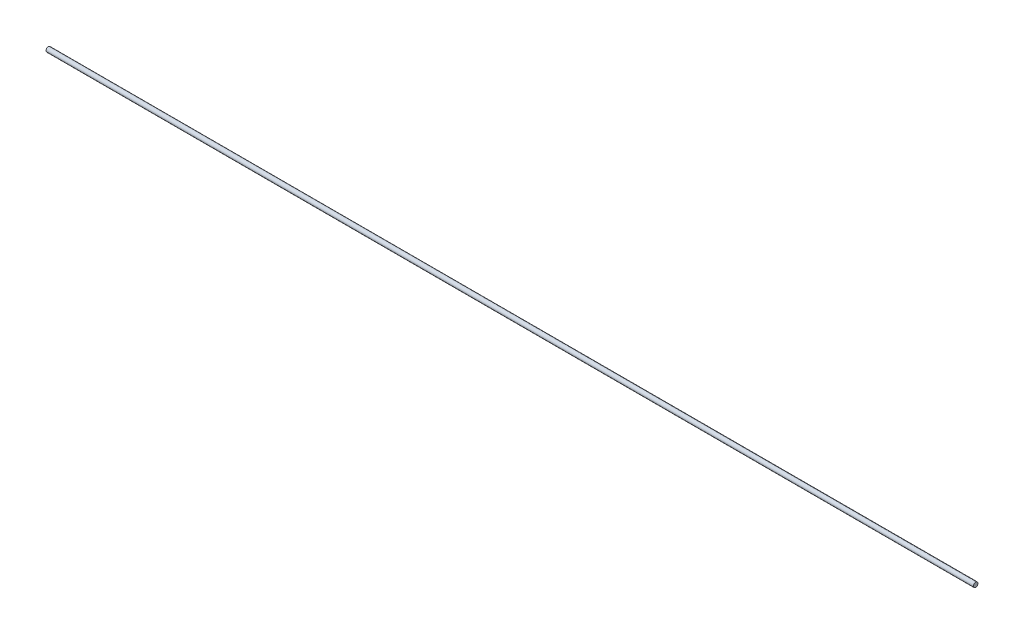
ISO-10303-21;
HEADER;
FILE_DESCRIPTION(('STEP AP214'),'2;1');
FILE_NAME('part.step','',(''),(''),'','','');
FILE_SCHEMA(('AUTOMOTIVE_DESIGN { 1 0 10303 214 1 1 1 1 }'));
ENDSEC;
DATA;
#1=APPLICATION_CONTEXT('core data for automotive mechanical design processes');
#2=APPLICATION_PROTOCOL_DEFINITION('international standard','automotive_design',2000,#1);
#3=PRODUCT_CONTEXT('',#1,'mechanical');
#4=PRODUCT('Part','Part','',(#3));
#5=PRODUCT_RELATED_PRODUCT_CATEGORY('part','',(#4));
#6=PRODUCT_DEFINITION_FORMATION('','',#4);
#7=PRODUCT_DEFINITION_CONTEXT('part definition',#1,'design');
#8=PRODUCT_DEFINITION('design','',#6,#7);
#9=PRODUCT_DEFINITION_SHAPE('','',#8);
#10=(LENGTH_UNIT() NAMED_UNIT(*) SI_UNIT(.MILLI.,.METRE.));
#11=(NAMED_UNIT(*) PLANE_ANGLE_UNIT() SI_UNIT($,.RADIAN.));
#12=(NAMED_UNIT(*) SI_UNIT($,.STERADIAN.) SOLID_ANGLE_UNIT());
#13=UNCERTAINTY_MEASURE_WITH_UNIT(LENGTH_MEASURE(1.E-05),#10,'distance_accuracy_value','');
#14=(GEOMETRIC_REPRESENTATION_CONTEXT(3) GLOBAL_UNCERTAINTY_ASSIGNED_CONTEXT((#13)) GLOBAL_UNIT_ASSIGNED_CONTEXT((#10,
#11,#12)) REPRESENTATION_CONTEXT('',''));
#15=CARTESIAN_POINT('',(0.,0.,0.));
#16=DIRECTION('',(0.,0.,1.));
#17=DIRECTION('',(1.,0.,0.));
#18=AXIS2_PLACEMENT_3D('',#15,#16,#17);
#19=CARTESIAN_POINT('',(600.,0.,0.));
#20=DIRECTION('',(-1.,0.,0.));
#21=DIRECTION('',(0.,0.,1.));
#22=AXIS2_PLACEMENT_3D('',#19,#20,#21);
#23=CYLINDRICAL_SURFACE('',#22,1.5);
#24=CARTESIAN_POINT('',(600.,0.,0.));
#25=DIRECTION('',(1.,0.,0.));
#26=DIRECTION('',(0.,0.,-1.));
#27=AXIS2_PLACEMENT_3D('',#24,#25,#26);
#28=CIRCLE('',#27,1.5);
#29=CARTESIAN_POINT('',(600.,0.,-1.5));
#30=VERTEX_POINT('',#29);
#31=EDGE_CURVE('E10',#30,#30,#28,.T.);
#32=ORIENTED_EDGE('',*,*,#31,.F.);
#33=EDGE_LOOP('',(#32));
#34=FACE_BOUND('',#33,.T.);
#35=CARTESIAN_POINT('',(0.,0.,0.));
#36=DIRECTION('',(1.,0.,0.));
#37=DIRECTION('',(0.,0.,-1.));
#38=AXIS2_PLACEMENT_3D('',#35,#36,#37);
#39=CIRCLE('',#38,1.5);
#40=CARTESIAN_POINT('',(0.,0.,-1.5));
#41=VERTEX_POINT('',#40);
#42=EDGE_CURVE('E34',#41,#41,#39,.T.);
#43=ORIENTED_EDGE('',*,*,#42,.T.);
#44=EDGE_LOOP('',(#43));
#45=FACE_BOUND('',#44,.T.);
#46=ADVANCED_FACE('F31',(#34,#45),#23,.T.);
#47=CARTESIAN_POINT('',(600.,0.,0.));
#48=DIRECTION('',(1.,0.,0.));
#49=DIRECTION('',(0.,0.,-1.));
#50=AXIS2_PLACEMENT_3D('',#47,#48,#49);
#51=PLANE('',#50);
#52=ORIENTED_EDGE('',*,*,#31,.T.);
#53=EDGE_LOOP('',(#52));
#54=FACE_BOUND('',#53,.T.);
#55=ADVANCED_FACE('F46',(#54),#51,.T.);
#56=CARTESIAN_POINT('',(0.,0.,0.));
#57=DIRECTION('',(1.,0.,0.));
#58=DIRECTION('',(0.,0.,-1.));
#59=AXIS2_PLACEMENT_3D('',#56,#57,#58);
#60=PLANE('',#59);
#61=ORIENTED_EDGE('',*,*,#42,.F.);
#62=EDGE_LOOP('',(#61));
#63=FACE_BOUND('',#62,.T.);
#64=ADVANCED_FACE('F44',(#63),#60,.F.);
#65=CLOSED_SHELL('',(#46,#55,#64));
#66=MANIFOLD_SOLID_BREP('B2',#65);
#67=ADVANCED_BREP_SHAPE_REPRESENTATION('',(#18,#66),#14);
#68=SHAPE_DEFINITION_REPRESENTATION(#9,#67);
ENDSEC;
END-ISO-10303-21;
